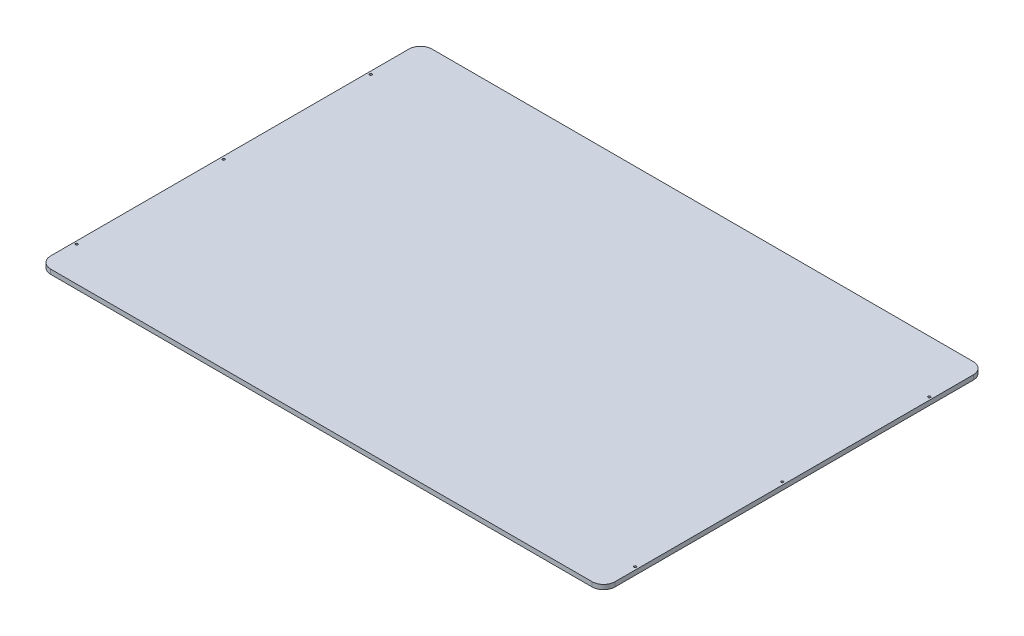
ISO-10303-21;
HEADER;
FILE_DESCRIPTION(('STEP AP214'),'2;1');
FILE_NAME('part.step','',(''),(''),'','','');
FILE_SCHEMA(('AUTOMOTIVE_DESIGN { 1 0 10303 214 1 1 1 1 }'));
ENDSEC;
DATA;
#1=APPLICATION_CONTEXT('core data for automotive mechanical design processes');
#2=APPLICATION_PROTOCOL_DEFINITION('international standard','automotive_design',2000,#1);
#3=PRODUCT_CONTEXT('',#1,'mechanical');
#4=PRODUCT('Part','Part','',(#3));
#5=PRODUCT_RELATED_PRODUCT_CATEGORY('part','',(#4));
#6=PRODUCT_DEFINITION_FORMATION('','',#4);
#7=PRODUCT_DEFINITION_CONTEXT('part definition',#1,'design');
#8=PRODUCT_DEFINITION('design','',#6,#7);
#9=PRODUCT_DEFINITION_SHAPE('','',#8);
#10=(LENGTH_UNIT() NAMED_UNIT(*) SI_UNIT(.MILLI.,.METRE.));
#11=(NAMED_UNIT(*) PLANE_ANGLE_UNIT() SI_UNIT($,.RADIAN.));
#12=(NAMED_UNIT(*) SI_UNIT($,.STERADIAN.) SOLID_ANGLE_UNIT());
#13=UNCERTAINTY_MEASURE_WITH_UNIT(LENGTH_MEASURE(1.E-05),#10,'distance_accuracy_value','');
#14=(GEOMETRIC_REPRESENTATION_CONTEXT(3) GLOBAL_UNCERTAINTY_ASSIGNED_CONTEXT((#13)) GLOBAL_UNIT_ASSIGNED_CONTEXT((#10,
#11,#12)) REPRESENTATION_CONTEXT('',''));
#15=CARTESIAN_POINT('',(0.,0.,0.));
#16=DIRECTION('',(0.,0.,1.));
#17=DIRECTION('',(1.,0.,0.));
#18=AXIS2_PLACEMENT_3D('',#15,#16,#17);
#19=CARTESIAN_POINT('',(0.,0.,0.));
#20=DIRECTION('',(0.,1.,0.));
#21=DIRECTION('',(0.,0.,1.));
#22=AXIS2_PLACEMENT_3D('',#19,#20,#21);
#23=PLANE('',#22);
#24=CARTESIAN_POINT('',(242.5,0.,-119.84));
#25=DIRECTION('',(0.,-1.,0.));
#26=DIRECTION('',(0.,0.,-1.));
#27=AXIS2_PLACEMENT_3D('',#24,#25,#26);
#28=CIRCLE('',#27,1.025);
#29=CARTESIAN_POINT('',(242.5,0.,-120.865));
#30=VERTEX_POINT('',#29);
#31=EDGE_CURVE('E179',#30,#30,#28,.T.);
#32=ORIENTED_EDGE('',*,*,#31,.F.);
#33=EDGE_LOOP('',(#32));
#34=FACE_BOUND('',#33,.T.);
#35=CARTESIAN_POINT('',(242.5,0.,7.83));
#36=DIRECTION('',(0.,-1.,0.));
#37=DIRECTION('',(0.,0.,-1.));
#38=AXIS2_PLACEMENT_3D('',#35,#36,#37);
#39=CIRCLE('',#38,1.025);
#40=CARTESIAN_POINT('',(242.5,0.,6.80500000000001));
#41=VERTEX_POINT('',#40);
#42=EDGE_CURVE('E168',#41,#41,#39,.T.);
#43=ORIENTED_EDGE('',*,*,#42,.F.);
#44=EDGE_LOOP('',(#43));
#45=FACE_BOUND('',#44,.T.);
#46=CARTESIAN_POINT('',(-242.5,0.,7.83));
#47=DIRECTION('',(0.,-1.,0.));
#48=DIRECTION('',(0.,0.,-1.));
#49=AXIS2_PLACEMENT_3D('',#46,#47,#48);
#50=CIRCLE('',#49,1.025);
#51=CARTESIAN_POINT('',(-242.5,0.,6.80500000000001));
#52=VERTEX_POINT('',#51);
#53=EDGE_CURVE('E187',#52,#52,#50,.T.);
#54=ORIENTED_EDGE('',*,*,#53,.F.);
#55=EDGE_LOOP('',(#54));
#56=FACE_BOUND('',#55,.T.);
#57=CARTESIAN_POINT('',(-242.5,0.,135.5));
#58=DIRECTION('',(0.,-1.,0.));
#59=DIRECTION('',(0.,0.,-1.));
#60=AXIS2_PLACEMENT_3D('',#57,#58,#59);
#61=CIRCLE('',#60,1.025);
#62=CARTESIAN_POINT('',(-242.5,0.,134.475));
#63=VERTEX_POINT('',#62);
#64=EDGE_CURVE('E190',#63,#63,#61,.T.);
#65=ORIENTED_EDGE('',*,*,#64,.F.);
#66=EDGE_LOOP('',(#65));
#67=FACE_BOUND('',#66,.T.);
#68=DIRECTION('',(0.,0.,-1.));
#69=VECTOR('',#68,1.);
#70=CARTESIAN_POINT('',(245.,0.,165.5));
#71=LINE('',#70,#69);
#72=CARTESIAN_POINT('',(245.,0.,155.5));
#73=VERTEX_POINT('',#72);
#74=CARTESIAN_POINT('',(245.,0.,-155.5));
#75=VERTEX_POINT('',#74);
#76=EDGE_CURVE('E122',#73,#75,#71,.T.);
#77=ORIENTED_EDGE('',*,*,#76,.F.);
#78=CARTESIAN_POINT('',(235.,0.,155.5));
#79=DIRECTION('',(0.,1.,0.));
#80=DIRECTION('',(0.,0.,1.));
#81=AXIS2_PLACEMENT_3D('',#78,#79,#80);
#82=CIRCLE('',#81,10.);
#83=CARTESIAN_POINT('',(235.,0.,165.5));
#84=VERTEX_POINT('',#83);
#85=EDGE_CURVE('E105',#73,#84,#82,.F.);
#86=ORIENTED_EDGE('',*,*,#85,.T.);
#87=DIRECTION('',(1.,0.,0.));
#88=VECTOR('',#87,1.);
#89=CARTESIAN_POINT('',(245.,0.,165.5));
#90=LINE('',#89,#88);
#91=CARTESIAN_POINT('',(-235.,0.,165.5));
#92=VERTEX_POINT('',#91);
#93=EDGE_CURVE('E132',#92,#84,#90,.T.);
#94=ORIENTED_EDGE('',*,*,#93,.F.);
#95=CARTESIAN_POINT('',(-235.,0.,155.5));
#96=DIRECTION('',(0.,1.,0.));
#97=DIRECTION('',(0.,0.,1.));
#98=AXIS2_PLACEMENT_3D('',#95,#96,#97);
#99=CIRCLE('',#98,10.);
#100=CARTESIAN_POINT('',(-245.,0.,155.5));
#101=VERTEX_POINT('',#100);
#102=EDGE_CURVE('E116',#92,#101,#99,.F.);
#103=ORIENTED_EDGE('',*,*,#102,.T.);
#104=DIRECTION('',(0.,0.,1.));
#105=VECTOR('',#104,1.);
#106=CARTESIAN_POINT('',(-245.,0.,165.5));
#107=LINE('',#106,#105);
#108=CARTESIAN_POINT('',(-245.,0.,-155.5));
#109=VERTEX_POINT('',#108);
#110=EDGE_CURVE('E136',#109,#101,#107,.T.);
#111=ORIENTED_EDGE('',*,*,#110,.F.);
#112=CARTESIAN_POINT('',(-235.,0.,-155.5));
#113=DIRECTION('',(0.,1.,0.));
#114=DIRECTION('',(0.,0.,1.));
#115=AXIS2_PLACEMENT_3D('',#112,#113,#114);
#116=CIRCLE('',#115,10.);
#117=CARTESIAN_POINT('',(-235.,0.,-165.5));
#118=VERTEX_POINT('',#117);
#119=EDGE_CURVE('E125',#109,#118,#116,.F.);
#120=ORIENTED_EDGE('',*,*,#119,.T.);
#121=DIRECTION('',(-1.,0.,0.));
#122=VECTOR('',#121,1.);
#123=CARTESIAN_POINT('',(245.,0.,-165.5));
#124=LINE('',#123,#122);
#125=CARTESIAN_POINT('',(235.,0.,-165.5));
#126=VERTEX_POINT('',#125);
#127=EDGE_CURVE('E131',#126,#118,#124,.T.);
#128=ORIENTED_EDGE('',*,*,#127,.F.);
#129=CARTESIAN_POINT('',(235.,0.,-155.5));
#130=DIRECTION('',(0.,1.,0.));
#131=DIRECTION('',(0.,0.,1.));
#132=AXIS2_PLACEMENT_3D('',#129,#130,#131);
#133=CIRCLE('',#132,10.);
#134=EDGE_CURVE('E130',#126,#75,#133,.F.);
#135=ORIENTED_EDGE('',*,*,#134,.T.);
#136=EDGE_LOOP('',(#77,#86,#94,#103,#111,#120,#128,#135));
#137=FACE_BOUND('',#136,.T.);
#138=CARTESIAN_POINT('',(-242.5,0.,-119.84));
#139=DIRECTION('',(0.,-1.,0.));
#140=DIRECTION('',(0.,0.,-1.));
#141=AXIS2_PLACEMENT_3D('',#138,#139,#140);
#142=CIRCLE('',#141,1.025);
#143=CARTESIAN_POINT('',(-242.5,0.,-120.865));
#144=VERTEX_POINT('',#143);
#145=EDGE_CURVE('E11',#144,#144,#142,.T.);
#146=ORIENTED_EDGE('',*,*,#145,.F.);
#147=EDGE_LOOP('',(#146));
#148=FACE_BOUND('',#147,.T.);
#149=CARTESIAN_POINT('',(242.5,0.,135.5));
#150=DIRECTION('',(0.,-1.,0.));
#151=DIRECTION('',(0.,0.,-1.));
#152=AXIS2_PLACEMENT_3D('',#149,#150,#151);
#153=CIRCLE('',#152,1.025);
#154=CARTESIAN_POINT('',(242.5,0.,134.475));
#155=VERTEX_POINT('',#154);
#156=EDGE_CURVE('E167',#155,#155,#153,.T.);
#157=ORIENTED_EDGE('',*,*,#156,.F.);
#158=EDGE_LOOP('',(#157));
#159=FACE_BOUND('',#158,.T.);
#160=ADVANCED_FACE('F36',(#34,#45,#56,#67,#137,#148,#159),#23,.F.);
#161=CARTESIAN_POINT('',(-242.5,0.,-119.84));
#162=DIRECTION('',(0.,-1.,0.));
#163=DIRECTION('',(0.,0.,-1.));
#164=AXIS2_PLACEMENT_3D('',#161,#162,#163);
#165=CYLINDRICAL_SURFACE('',#164,1.025);
#166=CARTESIAN_POINT('',(-242.5,4.,-119.84));
#167=DIRECTION('',(0.,1.,0.));
#168=DIRECTION('',(0.,0.,1.));
#169=AXIS2_PLACEMENT_3D('',#166,#167,#168);
#170=CIRCLE('',#169,1.025);
#171=CARTESIAN_POINT('',(-242.5,4.,-118.815));
#172=VERTEX_POINT('',#171);
#173=EDGE_CURVE('E45',#172,#172,#170,.T.);
#174=ORIENTED_EDGE('',*,*,#173,.T.);
#175=EDGE_LOOP('',(#174));
#176=FACE_BOUND('',#175,.T.);
#177=ORIENTED_EDGE('',*,*,#145,.T.);
#178=EDGE_LOOP('',(#177));
#179=FACE_BOUND('',#178,.T.);
#180=ADVANCED_FACE('F38',(#176,#179),#165,.F.);
#181=CARTESIAN_POINT('',(-245.,4.,165.5));
#182=DIRECTION('',(1.,0.,0.));
#183=DIRECTION('',(0.,0.,-1.));
#184=AXIS2_PLACEMENT_3D('',#181,#182,#183);
#185=PLANE('',#184);
#186=ORIENTED_EDGE('',*,*,#110,.T.);
#187=DIRECTION('',(0.,-1.,0.));
#188=VECTOR('',#187,1.);
#189=CARTESIAN_POINT('',(-245.,4.,155.5));
#190=LINE('',#189,#188);
#191=CARTESIAN_POINT('',(-245.,4.,155.5));
#192=VERTEX_POINT('',#191);
#193=EDGE_CURVE('E158',#101,#192,#190,.F.);
#194=ORIENTED_EDGE('',*,*,#193,.T.);
#195=DIRECTION('',(0.,0.,1.));
#196=VECTOR('',#195,1.);
#197=CARTESIAN_POINT('',(-245.,4.,165.5));
#198=LINE('',#197,#196);
#199=CARTESIAN_POINT('',(-245.,4.,-155.5));
#200=VERTEX_POINT('',#199);
#201=EDGE_CURVE('E134',#200,#192,#198,.T.);
#202=ORIENTED_EDGE('',*,*,#201,.F.);
#203=DIRECTION('',(0.,-1.,0.));
#204=VECTOR('',#203,1.);
#205=CARTESIAN_POINT('',(-245.,4.,-155.5));
#206=LINE('',#205,#204);
#207=EDGE_CURVE('E155',#200,#109,#206,.T.);
#208=ORIENTED_EDGE('',*,*,#207,.T.);
#209=EDGE_LOOP('',(#186,#194,#202,#208));
#210=FACE_BOUND('',#209,.T.);
#211=ADVANCED_FACE('F206',(#210),#185,.F.);
#212=CARTESIAN_POINT('',(245.,4.,165.5));
#213=DIRECTION('',(0.,0.,-1.));
#214=DIRECTION('',(-1.,0.,0.));
#215=AXIS2_PLACEMENT_3D('',#212,#213,#214);
#216=PLANE('',#215);
#217=ORIENTED_EDGE('',*,*,#93,.T.);
#218=DIRECTION('',(0.,-1.,0.));
#219=VECTOR('',#218,1.);
#220=CARTESIAN_POINT('',(235.,4.,165.5));
#221=LINE('',#220,#219);
#222=CARTESIAN_POINT('',(235.,4.,165.5));
#223=VERTEX_POINT('',#222);
#224=EDGE_CURVE('E110',#84,#223,#221,.F.);
#225=ORIENTED_EDGE('',*,*,#224,.T.);
#226=DIRECTION('',(1.,0.,0.));
#227=VECTOR('',#226,1.);
#228=CARTESIAN_POINT('',(245.,4.,165.5));
#229=LINE('',#228,#227);
#230=CARTESIAN_POINT('',(-235.,4.,165.5));
#231=VERTEX_POINT('',#230);
#232=EDGE_CURVE('E198',#231,#223,#229,.T.);
#233=ORIENTED_EDGE('',*,*,#232,.F.);
#234=DIRECTION('',(0.,-1.,0.));
#235=VECTOR('',#234,1.);
#236=CARTESIAN_POINT('',(-235.,4.,165.5));
#237=LINE('',#236,#235);
#238=EDGE_CURVE('E115',#231,#92,#237,.T.);
#239=ORIENTED_EDGE('',*,*,#238,.T.);
#240=EDGE_LOOP('',(#217,#225,#233,#239));
#241=FACE_BOUND('',#240,.T.);
#242=ADVANCED_FACE('F217',(#241),#216,.F.);
#243=CARTESIAN_POINT('',(245.,4.,165.5));
#244=DIRECTION('',(-1.,0.,0.));
#245=DIRECTION('',(0.,0.,1.));
#246=AXIS2_PLACEMENT_3D('',#243,#244,#245);
#247=PLANE('',#246);
#248=DIRECTION('',(0.,0.,-1.));
#249=VECTOR('',#248,1.);
#250=CARTESIAN_POINT('',(245.,4.,165.5));
#251=LINE('',#250,#249);
#252=CARTESIAN_POINT('',(245.,4.,155.5));
#253=VERTEX_POINT('',#252);
#254=CARTESIAN_POINT('',(245.,4.,-155.5));
#255=VERTEX_POINT('',#254);
#256=EDGE_CURVE('E124',#253,#255,#251,.T.);
#257=ORIENTED_EDGE('',*,*,#256,.F.);
#258=DIRECTION('',(0.,-1.,0.));
#259=VECTOR('',#258,1.);
#260=CARTESIAN_POINT('',(245.,4.,155.5));
#261=LINE('',#260,#259);
#262=EDGE_CURVE('E109',#253,#73,#261,.T.);
#263=ORIENTED_EDGE('',*,*,#262,.T.);
#264=ORIENTED_EDGE('',*,*,#76,.T.);
#265=DIRECTION('',(0.,-1.,0.));
#266=VECTOR('',#265,1.);
#267=CARTESIAN_POINT('',(245.,4.,-155.5));
#268=LINE('',#267,#266);
#269=EDGE_CURVE('E126',#75,#255,#268,.F.);
#270=ORIENTED_EDGE('',*,*,#269,.T.);
#271=EDGE_LOOP('',(#257,#263,#264,#270));
#272=FACE_BOUND('',#271,.T.);
#273=ADVANCED_FACE('F121',(#272),#247,.F.);
#274=CARTESIAN_POINT('',(245.,4.,-165.5));
#275=DIRECTION('',(0.,0.,1.));
#276=DIRECTION('',(1.,0.,0.));
#277=AXIS2_PLACEMENT_3D('',#274,#275,#276);
#278=PLANE('',#277);
#279=DIRECTION('',(-1.,0.,0.));
#280=VECTOR('',#279,1.);
#281=CARTESIAN_POINT('',(245.,4.,-165.5));
#282=LINE('',#281,#280);
#283=CARTESIAN_POINT('',(235.,4.,-165.5));
#284=VERTEX_POINT('',#283);
#285=CARTESIAN_POINT('',(-235.,4.,-165.5));
#286=VERTEX_POINT('',#285);
#287=EDGE_CURVE('E140',#284,#286,#282,.T.);
#288=ORIENTED_EDGE('',*,*,#287,.F.);
#289=DIRECTION('',(0.,-1.,0.));
#290=VECTOR('',#289,1.);
#291=CARTESIAN_POINT('',(235.,4.,-165.5));
#292=LINE('',#291,#290);
#293=EDGE_CURVE('E161',#284,#126,#292,.T.);
#294=ORIENTED_EDGE('',*,*,#293,.T.);
#295=ORIENTED_EDGE('',*,*,#127,.T.);
#296=DIRECTION('',(0.,-1.,0.));
#297=VECTOR('',#296,1.);
#298=CARTESIAN_POINT('',(-235.,4.,-165.5));
#299=LINE('',#298,#297);
#300=EDGE_CURVE('E53',#118,#286,#299,.F.);
#301=ORIENTED_EDGE('',*,*,#300,.T.);
#302=EDGE_LOOP('',(#288,#294,#295,#301));
#303=FACE_BOUND('',#302,.T.);
#304=ADVANCED_FACE('F224',(#303),#278,.F.);
#305=CARTESIAN_POINT('',(0.,4.,0.));
#306=DIRECTION('',(0.,1.,0.));
#307=DIRECTION('',(0.,0.,1.));
#308=AXIS2_PLACEMENT_3D('',#305,#306,#307);
#309=PLANE('',#308);
#310=CARTESIAN_POINT('',(242.5,4.,-119.84));
#311=DIRECTION('',(0.,1.,0.));
#312=DIRECTION('',(0.,0.,1.));
#313=AXIS2_PLACEMENT_3D('',#310,#311,#312);
#314=CIRCLE('',#313,1.025);
#315=CARTESIAN_POINT('',(242.5,4.,-118.815));
#316=VERTEX_POINT('',#315);
#317=EDGE_CURVE('E40',#316,#316,#314,.T.);
#318=ORIENTED_EDGE('',*,*,#317,.F.);
#319=EDGE_LOOP('',(#318));
#320=FACE_BOUND('',#319,.T.);
#321=CARTESIAN_POINT('',(242.5,4.,7.83));
#322=DIRECTION('',(0.,1.,0.));
#323=DIRECTION('',(0.,0.,1.));
#324=AXIS2_PLACEMENT_3D('',#321,#322,#323);
#325=CIRCLE('',#324,1.025);
#326=CARTESIAN_POINT('',(242.5,4.,8.855));
#327=VERTEX_POINT('',#326);
#328=EDGE_CURVE('E165',#327,#327,#325,.T.);
#329=ORIENTED_EDGE('',*,*,#328,.F.);
#330=EDGE_LOOP('',(#329));
#331=FACE_BOUND('',#330,.T.);
#332=CARTESIAN_POINT('',(242.5,4.,135.5));
#333=DIRECTION('',(0.,1.,0.));
#334=DIRECTION('',(0.,0.,1.));
#335=AXIS2_PLACEMENT_3D('',#332,#333,#334);
#336=CIRCLE('',#335,1.025);
#337=CARTESIAN_POINT('',(242.5,4.,136.525));
#338=VERTEX_POINT('',#337);
#339=EDGE_CURVE('E172',#338,#338,#336,.T.);
#340=ORIENTED_EDGE('',*,*,#339,.F.);
#341=EDGE_LOOP('',(#340));
#342=FACE_BOUND('',#341,.T.);
#343=CARTESIAN_POINT('',(-242.5,4.,7.83));
#344=DIRECTION('',(0.,1.,0.));
#345=DIRECTION('',(0.,0.,1.));
#346=AXIS2_PLACEMENT_3D('',#343,#344,#345);
#347=CIRCLE('',#346,1.025);
#348=CARTESIAN_POINT('',(-242.5,4.,8.855));
#349=VERTEX_POINT('',#348);
#350=EDGE_CURVE('E184',#349,#349,#347,.T.);
#351=ORIENTED_EDGE('',*,*,#350,.F.);
#352=EDGE_LOOP('',(#351));
#353=FACE_BOUND('',#352,.T.);
#354=CARTESIAN_POINT('',(-242.5,4.,135.5));
#355=DIRECTION('',(0.,1.,0.));
#356=DIRECTION('',(0.,0.,1.));
#357=AXIS2_PLACEMENT_3D('',#354,#355,#356);
#358=CIRCLE('',#357,1.025);
#359=CARTESIAN_POINT('',(-242.5,4.,136.525));
#360=VERTEX_POINT('',#359);
#361=EDGE_CURVE('E193',#360,#360,#358,.T.);
#362=ORIENTED_EDGE('',*,*,#361,.F.);
#363=EDGE_LOOP('',(#362));
#364=FACE_BOUND('',#363,.T.);
#365=ORIENTED_EDGE('',*,*,#232,.T.);
#366=CARTESIAN_POINT('',(235.,4.,155.5));
#367=DIRECTION('',(0.,1.,0.));
#368=DIRECTION('',(0.,0.,1.));
#369=AXIS2_PLACEMENT_3D('',#366,#367,#368);
#370=CIRCLE('',#369,10.);
#371=EDGE_CURVE('E153',#223,#253,#370,.T.);
#372=ORIENTED_EDGE('',*,*,#371,.T.);
#373=ORIENTED_EDGE('',*,*,#256,.T.);
#374=CARTESIAN_POINT('',(235.,4.,-155.5));
#375=DIRECTION('',(0.,1.,0.));
#376=DIRECTION('',(0.,0.,1.));
#377=AXIS2_PLACEMENT_3D('',#374,#375,#376);
#378=CIRCLE('',#377,10.);
#379=EDGE_CURVE('E60',#255,#284,#378,.T.);
#380=ORIENTED_EDGE('',*,*,#379,.T.);
#381=ORIENTED_EDGE('',*,*,#287,.T.);
#382=CARTESIAN_POINT('',(-235.,4.,-155.5));
#383=DIRECTION('',(0.,1.,0.));
#384=DIRECTION('',(0.,0.,1.));
#385=AXIS2_PLACEMENT_3D('',#382,#383,#384);
#386=CIRCLE('',#385,10.);
#387=EDGE_CURVE('E148',#286,#200,#386,.T.);
#388=ORIENTED_EDGE('',*,*,#387,.T.);
#389=ORIENTED_EDGE('',*,*,#201,.T.);
#390=CARTESIAN_POINT('',(-235.,4.,155.5));
#391=DIRECTION('',(0.,1.,0.));
#392=DIRECTION('',(0.,0.,1.));
#393=AXIS2_PLACEMENT_3D('',#390,#391,#392);
#394=CIRCLE('',#393,10.);
#395=EDGE_CURVE('E151',#192,#231,#394,.T.);
#396=ORIENTED_EDGE('',*,*,#395,.T.);
#397=EDGE_LOOP('',(#365,#372,#373,#380,#381,#388,#389,#396));
#398=FACE_BOUND('',#397,.T.);
#399=ORIENTED_EDGE('',*,*,#173,.F.);
#400=EDGE_LOOP('',(#399));
#401=FACE_BOUND('',#400,.T.);
#402=ADVANCED_FACE('F214',(#320,#331,#342,#353,#364,#398,#401),#309,.T.);
#403=CARTESIAN_POINT('',(235.,4.,155.5));
#404=DIRECTION('',(0.,-1.,0.));
#405=DIRECTION('',(0.,0.,-1.));
#406=AXIS2_PLACEMENT_3D('',#403,#404,#405);
#407=CYLINDRICAL_SURFACE('',#406,10.);
#408=ORIENTED_EDGE('',*,*,#371,.F.);
#409=ORIENTED_EDGE('',*,*,#224,.F.);
#410=ORIENTED_EDGE('',*,*,#85,.F.);
#411=ORIENTED_EDGE('',*,*,#262,.F.);
#412=EDGE_LOOP('',(#408,#409,#410,#411));
#413=FACE_BOUND('',#412,.T.);
#414=ADVANCED_FACE('F108',(#413),#407,.T.);
#415=CARTESIAN_POINT('',(-235.,4.,155.5));
#416=DIRECTION('',(0.,-1.,0.));
#417=DIRECTION('',(0.,0.,-1.));
#418=AXIS2_PLACEMENT_3D('',#415,#416,#417);
#419=CYLINDRICAL_SURFACE('',#418,10.);
#420=ORIENTED_EDGE('',*,*,#395,.F.);
#421=ORIENTED_EDGE('',*,*,#193,.F.);
#422=ORIENTED_EDGE('',*,*,#102,.F.);
#423=ORIENTED_EDGE('',*,*,#238,.F.);
#424=EDGE_LOOP('',(#420,#421,#422,#423));
#425=FACE_BOUND('',#424,.T.);
#426=ADVANCED_FACE('F211',(#425),#419,.T.);
#427=CARTESIAN_POINT('',(235.,4.,-155.5));
#428=DIRECTION('',(0.,-1.,0.));
#429=DIRECTION('',(0.,0.,-1.));
#430=AXIS2_PLACEMENT_3D('',#427,#428,#429);
#431=CYLINDRICAL_SURFACE('',#430,10.);
#432=ORIENTED_EDGE('',*,*,#379,.F.);
#433=ORIENTED_EDGE('',*,*,#269,.F.);
#434=ORIENTED_EDGE('',*,*,#134,.F.);
#435=ORIENTED_EDGE('',*,*,#293,.F.);
#436=EDGE_LOOP('',(#432,#433,#434,#435));
#437=FACE_BOUND('',#436,.T.);
#438=ADVANCED_FACE('F247',(#437),#431,.T.);
#439=CARTESIAN_POINT('',(-235.,4.,-155.5));
#440=DIRECTION('',(0.,-1.,0.));
#441=DIRECTION('',(0.,0.,-1.));
#442=AXIS2_PLACEMENT_3D('',#439,#440,#441);
#443=CYLINDRICAL_SURFACE('',#442,10.);
#444=ORIENTED_EDGE('',*,*,#387,.F.);
#445=ORIENTED_EDGE('',*,*,#300,.F.);
#446=ORIENTED_EDGE('',*,*,#119,.F.);
#447=ORIENTED_EDGE('',*,*,#207,.F.);
#448=EDGE_LOOP('',(#444,#445,#446,#447));
#449=FACE_BOUND('',#448,.T.);
#450=ADVANCED_FACE('F249',(#449),#443,.T.);
#451=CARTESIAN_POINT('',(-242.5,0.,135.5));
#452=DIRECTION('',(0.,-1.,0.));
#453=DIRECTION('',(0.,0.,-1.));
#454=AXIS2_PLACEMENT_3D('',#451,#452,#453);
#455=CYLINDRICAL_SURFACE('',#454,1.025);
#456=ORIENTED_EDGE('',*,*,#361,.T.);
#457=EDGE_LOOP('',(#456));
#458=FACE_BOUND('',#457,.T.);
#459=ORIENTED_EDGE('',*,*,#64,.T.);
#460=EDGE_LOOP('',(#459));
#461=FACE_BOUND('',#460,.T.);
#462=ADVANCED_FACE('F255',(#458,#461),#455,.F.);
#463=CARTESIAN_POINT('',(-242.5,0.,7.83));
#464=DIRECTION('',(0.,-1.,0.));
#465=DIRECTION('',(0.,0.,-1.));
#466=AXIS2_PLACEMENT_3D('',#463,#464,#465);
#467=CYLINDRICAL_SURFACE('',#466,1.025);
#468=ORIENTED_EDGE('',*,*,#350,.T.);
#469=EDGE_LOOP('',(#468));
#470=FACE_BOUND('',#469,.T.);
#471=ORIENTED_EDGE('',*,*,#53,.T.);
#472=EDGE_LOOP('',(#471));
#473=FACE_BOUND('',#472,.T.);
#474=ADVANCED_FACE('F287',(#470,#473),#467,.F.);
#475=CARTESIAN_POINT('',(242.5,0.,135.5));
#476=DIRECTION('',(0.,-1.,0.));
#477=DIRECTION('',(0.,0.,-1.));
#478=AXIS2_PLACEMENT_3D('',#475,#476,#477);
#479=CYLINDRICAL_SURFACE('',#478,1.025);
#480=ORIENTED_EDGE('',*,*,#339,.T.);
#481=EDGE_LOOP('',(#480));
#482=FACE_BOUND('',#481,.T.);
#483=ORIENTED_EDGE('',*,*,#156,.T.);
#484=EDGE_LOOP('',(#483));
#485=FACE_BOUND('',#484,.T.);
#486=ADVANCED_FACE('F301',(#482,#485),#479,.F.);
#487=CARTESIAN_POINT('',(242.5,0.,7.83));
#488=DIRECTION('',(0.,-1.,0.));
#489=DIRECTION('',(0.,0.,-1.));
#490=AXIS2_PLACEMENT_3D('',#487,#488,#489);
#491=CYLINDRICAL_SURFACE('',#490,1.025);
#492=ORIENTED_EDGE('',*,*,#328,.T.);
#493=EDGE_LOOP('',(#492));
#494=FACE_BOUND('',#493,.T.);
#495=ORIENTED_EDGE('',*,*,#42,.T.);
#496=EDGE_LOOP('',(#495));
#497=FACE_BOUND('',#496,.T.);
#498=ADVANCED_FACE('F321',(#494,#497),#491,.F.);
#499=CARTESIAN_POINT('',(242.5,0.,-119.84));
#500=DIRECTION('',(0.,-1.,0.));
#501=DIRECTION('',(0.,0.,-1.));
#502=AXIS2_PLACEMENT_3D('',#499,#500,#501);
#503=CYLINDRICAL_SURFACE('',#502,1.025);
#504=ORIENTED_EDGE('',*,*,#317,.T.);
#505=EDGE_LOOP('',(#504));
#506=FACE_BOUND('',#505,.T.);
#507=ORIENTED_EDGE('',*,*,#31,.T.);
#508=EDGE_LOOP('',(#507));
#509=FACE_BOUND('',#508,.T.);
#510=ADVANCED_FACE('F331',(#506,#509),#503,.F.);
#511=CLOSED_SHELL('',(#160,#180,#211,#242,#273,#304,#402,#414,#426,#438,#450,#462,#474,#486,
#498,#510));
#512=MANIFOLD_SOLID_BREP('B2',#511);
#513=ADVANCED_BREP_SHAPE_REPRESENTATION('',(#18,#512),#14);
#514=SHAPE_DEFINITION_REPRESENTATION(#9,#513);
ENDSEC;
END-ISO-10303-21;
